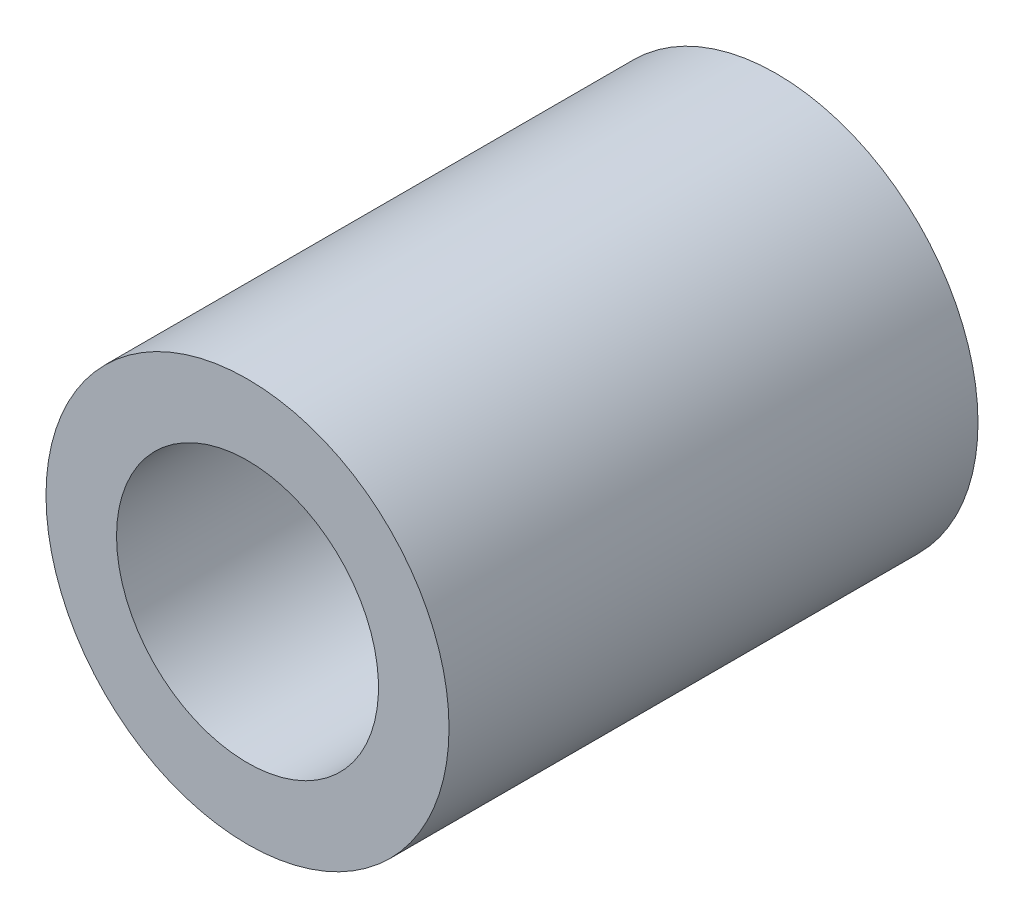
ISO-10303-21;
HEADER;
FILE_DESCRIPTION(('STEP AP214'),'2;1');
FILE_NAME('part.step','',(''),(''),'','','');
FILE_SCHEMA(('AUTOMOTIVE_DESIGN { 1 0 10303 214 1 1 1 1 }'));
ENDSEC;
DATA;
#1=APPLICATION_CONTEXT('core data for automotive mechanical design processes');
#2=APPLICATION_PROTOCOL_DEFINITION('international standard','automotive_design',2000,#1);
#3=PRODUCT_CONTEXT('',#1,'mechanical');
#4=PRODUCT('Part','Part','',(#3));
#5=PRODUCT_RELATED_PRODUCT_CATEGORY('part','',(#4));
#6=PRODUCT_DEFINITION_FORMATION('','',#4);
#7=PRODUCT_DEFINITION_CONTEXT('part definition',#1,'design');
#8=PRODUCT_DEFINITION('design','',#6,#7);
#9=PRODUCT_DEFINITION_SHAPE('','',#8);
#10=(LENGTH_UNIT() NAMED_UNIT(*) SI_UNIT(.MILLI.,.METRE.));
#11=(NAMED_UNIT(*) PLANE_ANGLE_UNIT() SI_UNIT($,.RADIAN.));
#12=(NAMED_UNIT(*) SI_UNIT($,.STERADIAN.) SOLID_ANGLE_UNIT());
#13=UNCERTAINTY_MEASURE_WITH_UNIT(LENGTH_MEASURE(1.E-05),#10,'distance_accuracy_value','');
#14=(GEOMETRIC_REPRESENTATION_CONTEXT(3) GLOBAL_UNCERTAINTY_ASSIGNED_CONTEXT((#13)) GLOBAL_UNIT_ASSIGNED_CONTEXT((#10,
#11,#12)) REPRESENTATION_CONTEXT('',''));
#15=CARTESIAN_POINT('',(0.,0.,0.));
#16=DIRECTION('',(0.,0.,1.));
#17=DIRECTION('',(1.,0.,0.));
#18=AXIS2_PLACEMENT_3D('',#15,#16,#17);
#19=CARTESIAN_POINT('',(0.,0.,10.5));
#20=DIRECTION('',(0.,0.,1.));
#21=DIRECTION('',(1.,0.,0.));
#22=AXIS2_PLACEMENT_3D('',#19,#20,#21);
#23=PLANE('',#22);
#24=CARTESIAN_POINT('',(0.,0.,10.5));
#25=DIRECTION('',(0.,0.,1.));
#26=DIRECTION('',(1.,0.,0.));
#27=AXIS2_PLACEMENT_3D('',#24,#25,#26);
#28=CIRCLE('',#27,4.);
#29=CARTESIAN_POINT('',(-4.,0.,10.5));
#30=VERTEX_POINT('',#29);
#31=EDGE_CURVE('E10',#30,#30,#28,.T.);
#32=ORIENTED_EDGE('',*,*,#31,.T.);
#33=EDGE_LOOP('',(#32));
#34=FACE_BOUND('',#33,.T.);
#35=CARTESIAN_POINT('',(0.,0.,10.5));
#36=DIRECTION('',(0.,0.,1.));
#37=DIRECTION('',(1.,0.,0.));
#38=AXIS2_PLACEMENT_3D('',#35,#36,#37);
#39=CIRCLE('',#38,2.6);
#40=CARTESIAN_POINT('',(-2.6,0.,10.5));
#41=VERTEX_POINT('',#40);
#42=EDGE_CURVE('E42',#41,#41,#39,.T.);
#43=ORIENTED_EDGE('',*,*,#42,.F.);
#44=EDGE_LOOP('',(#43));
#45=FACE_BOUND('',#44,.T.);
#46=ADVANCED_FACE('F31',(#34,#45),#23,.T.);
#47=CARTESIAN_POINT('',(0.,0.,0.));
#48=DIRECTION('',(0.,0.,1.));
#49=DIRECTION('',(1.,0.,0.));
#50=AXIS2_PLACEMENT_3D('',#47,#48,#49);
#51=PLANE('',#50);
#52=CARTESIAN_POINT('',(0.,0.,0.));
#53=DIRECTION('',(0.,0.,1.));
#54=DIRECTION('',(1.,0.,0.));
#55=AXIS2_PLACEMENT_3D('',#52,#53,#54);
#56=CIRCLE('',#55,4.);
#57=CARTESIAN_POINT('',(-4.,0.,0.));
#58=VERTEX_POINT('',#57);
#59=EDGE_CURVE('E35',#58,#58,#56,.T.);
#60=ORIENTED_EDGE('',*,*,#59,.F.);
#61=EDGE_LOOP('',(#60));
#62=FACE_BOUND('',#61,.T.);
#63=CARTESIAN_POINT('',(0.,0.,0.));
#64=DIRECTION('',(0.,0.,1.));
#65=DIRECTION('',(1.,0.,0.));
#66=AXIS2_PLACEMENT_3D('',#63,#64,#65);
#67=CIRCLE('',#66,2.6);
#68=CARTESIAN_POINT('',(-2.6,0.,0.));
#69=VERTEX_POINT('',#68);
#70=EDGE_CURVE('E44',#69,#69,#67,.T.);
#71=ORIENTED_EDGE('',*,*,#70,.T.);
#72=EDGE_LOOP('',(#71));
#73=FACE_BOUND('',#72,.T.);
#74=ADVANCED_FACE('F54',(#62,#73),#51,.F.);
#75=CARTESIAN_POINT('',(0.,0.,10.5));
#76=DIRECTION('',(0.,0.,-1.));
#77=DIRECTION('',(-1.,0.,0.));
#78=AXIS2_PLACEMENT_3D('',#75,#76,#77);
#79=CYLINDRICAL_SURFACE('',#78,4.);
#80=CARTESIAN_POINT('',(-4.,0.,10.5));
#81=CARTESIAN_POINT('',(-4.,0.,10.390625));
#82=CARTESIAN_POINT('',(-4.,0.,10.28125));
#83=CARTESIAN_POINT('',(-4.,0.,10.0625));
#84=CARTESIAN_POINT('',(-4.,0.,9.953125));
#85=CARTESIAN_POINT('',(-4.,0.,9.734375));
#86=CARTESIAN_POINT('',(-4.,0.,9.625));
#87=CARTESIAN_POINT('',(-4.,0.,9.40625));
#88=CARTESIAN_POINT('',(-4.,0.,9.296875));
#89=CARTESIAN_POINT('',(-4.,0.,9.078125));
#90=CARTESIAN_POINT('',(-4.,0.,8.96875));
#91=CARTESIAN_POINT('',(-4.,0.,8.75));
#92=CARTESIAN_POINT('',(-4.,0.,8.640625));
#93=CARTESIAN_POINT('',(-4.,0.,8.421875));
#94=CARTESIAN_POINT('',(-4.,0.,8.3125));
#95=CARTESIAN_POINT('',(-4.,0.,8.09375));
#96=CARTESIAN_POINT('',(-4.,0.,7.984375));
#97=CARTESIAN_POINT('',(-4.,0.,7.765625));
#98=CARTESIAN_POINT('',(-4.,0.,7.65625));
#99=CARTESIAN_POINT('',(-4.,0.,7.4375));
#100=CARTESIAN_POINT('',(-4.,0.,7.328125));
#101=CARTESIAN_POINT('',(-4.,0.,7.109375));
#102=CARTESIAN_POINT('',(-4.,0.,7.));
#103=CARTESIAN_POINT('',(-4.,0.,6.78125));
#104=CARTESIAN_POINT('',(-4.,0.,6.671875));
#105=CARTESIAN_POINT('',(-4.,0.,6.453125));
#106=CARTESIAN_POINT('',(-4.,0.,6.34375));
#107=CARTESIAN_POINT('',(-4.,0.,6.125));
#108=CARTESIAN_POINT('',(-4.,0.,6.015625));
#109=CARTESIAN_POINT('',(-4.,0.,5.796875));
#110=CARTESIAN_POINT('',(-4.,0.,5.6875));
#111=CARTESIAN_POINT('',(-4.,0.,5.46875));
#112=CARTESIAN_POINT('',(-4.,0.,5.359375));
#113=CARTESIAN_POINT('',(-4.,0.,5.140625));
#114=CARTESIAN_POINT('',(-4.,0.,5.03125));
#115=CARTESIAN_POINT('',(-4.,0.,4.8125));
#116=CARTESIAN_POINT('',(-4.,0.,4.703125));
#117=CARTESIAN_POINT('',(-4.,0.,4.484375));
#118=CARTESIAN_POINT('',(-4.,0.,4.375));
#119=CARTESIAN_POINT('',(-4.,0.,4.15625));
#120=CARTESIAN_POINT('',(-4.,0.,4.046875));
#121=CARTESIAN_POINT('',(-4.,0.,3.828125));
#122=CARTESIAN_POINT('',(-4.,0.,3.71875));
#123=CARTESIAN_POINT('',(-4.,0.,3.5));
#124=CARTESIAN_POINT('',(-4.,0.,3.390625));
#125=CARTESIAN_POINT('',(-4.,0.,3.171875));
#126=CARTESIAN_POINT('',(-4.,0.,3.0625));
#127=CARTESIAN_POINT('',(-4.,0.,2.84375));
#128=CARTESIAN_POINT('',(-4.,0.,2.734375));
#129=CARTESIAN_POINT('',(-4.,0.,2.515625));
#130=CARTESIAN_POINT('',(-4.,0.,2.40625));
#131=CARTESIAN_POINT('',(-4.,0.,2.1875));
#132=CARTESIAN_POINT('',(-4.,0.,2.078125));
#133=CARTESIAN_POINT('',(-4.,0.,1.859375));
#134=CARTESIAN_POINT('',(-4.,0.,1.75));
#135=CARTESIAN_POINT('',(-4.,0.,1.53125));
#136=CARTESIAN_POINT('',(-4.,0.,1.421875));
#137=CARTESIAN_POINT('',(-4.,0.,1.203125));
#138=CARTESIAN_POINT('',(-4.,0.,1.09375));
#139=CARTESIAN_POINT('',(-4.,0.,0.875000000000001));
#140=CARTESIAN_POINT('',(-4.,0.,0.765625000000001));
#141=CARTESIAN_POINT('',(-4.,0.,0.546875));
#142=CARTESIAN_POINT('',(-4.,0.,0.4375));
#143=CARTESIAN_POINT('',(-4.,0.,0.21875));
#144=CARTESIAN_POINT('',(-4.,0.,0.109375));
#145=CARTESIAN_POINT('',(-4.,0.,0.));
#146=B_SPLINE_CURVE_WITH_KNOTS('',3,(#80,#81,#82,#83,#84,#85,#86,#87,#88,#89,#90,#91,#92,#93,
#94,#95,#96,#97,#98,#99,#100,#101,#102,#103,#104,#105,#106,#107,#108,#109,#110,#111,#112,#113,
#114,#115,#116,#117,#118,#119,#120,#121,#122,#123,#124,#125,#126,#127,#128,#129,#130,#131,#132,
#133,#134,#135,#136,#137,#138,#139,#140,#141,#142,#143,#144,#145),.UNSPECIFIED.,.F.,.F.,(4,2,2,
2,2,2,2,2,2,2,2,2,2,2,2,2,2,2,2,2,2,2,2,2,2,2,2,2,2,2,2,2,4),(0.,0.328124999999999,
0.656249999999999,0.984374999999999,1.3125,1.640625,1.96875,2.296875,2.625,2.953125,3.28125,
3.609375,3.9375,4.265625,4.59375,4.921875,5.25,5.578125,5.90625,6.234375,6.5625,6.890625,
7.21875,7.546875,7.875,8.203125,8.53125,8.859375,9.1875,9.515625,9.84375,10.171875,10.5),.UNSPECIFIED.);
#147=EDGE_CURVE('BSEAM33',#30,#58,#146,.T.);
#148=ORIENTED_EDGE('',*,*,#31,.F.);
#149=ORIENTED_EDGE('',*,*,#59,.T.);
#150=ORIENTED_EDGE('',*,*,#147,.T.);
#151=ORIENTED_EDGE('',*,*,#147,.F.);
#152=EDGE_LOOP('',(#148,#150,#149,#151));
#153=FACE_BOUND('',#152,.T.);
#154=ADVANCED_FACE('F33',(#153),#79,.T.);
#155=CARTESIAN_POINT('',(0.,0.,10.5));
#156=DIRECTION('',(0.,0.,-1.));
#157=DIRECTION('',(-1.,0.,0.));
#158=AXIS2_PLACEMENT_3D('',#155,#156,#157);
#159=CYLINDRICAL_SURFACE('',#158,2.6);
#160=CARTESIAN_POINT('',(-2.6,0.,10.5));
#161=CARTESIAN_POINT('',(-2.6,0.,10.390625));
#162=CARTESIAN_POINT('',(-2.6,0.,10.28125));
#163=CARTESIAN_POINT('',(-2.6,0.,10.0625));
#164=CARTESIAN_POINT('',(-2.6,0.,9.953125));
#165=CARTESIAN_POINT('',(-2.6,0.,9.734375));
#166=CARTESIAN_POINT('',(-2.6,0.,9.625));
#167=CARTESIAN_POINT('',(-2.6,0.,9.40625));
#168=CARTESIAN_POINT('',(-2.6,0.,9.296875));
#169=CARTESIAN_POINT('',(-2.6,0.,9.078125));
#170=CARTESIAN_POINT('',(-2.6,0.,8.96875));
#171=CARTESIAN_POINT('',(-2.6,0.,8.75));
#172=CARTESIAN_POINT('',(-2.6,0.,8.640625));
#173=CARTESIAN_POINT('',(-2.6,0.,8.421875));
#174=CARTESIAN_POINT('',(-2.6,0.,8.3125));
#175=CARTESIAN_POINT('',(-2.6,0.,8.09375));
#176=CARTESIAN_POINT('',(-2.6,0.,7.984375));
#177=CARTESIAN_POINT('',(-2.6,0.,7.765625));
#178=CARTESIAN_POINT('',(-2.6,0.,7.65625));
#179=CARTESIAN_POINT('',(-2.6,0.,7.4375));
#180=CARTESIAN_POINT('',(-2.6,0.,7.328125));
#181=CARTESIAN_POINT('',(-2.6,0.,7.109375));
#182=CARTESIAN_POINT('',(-2.6,0.,7.));
#183=CARTESIAN_POINT('',(-2.6,0.,6.78125));
#184=CARTESIAN_POINT('',(-2.6,0.,6.671875));
#185=CARTESIAN_POINT('',(-2.6,0.,6.453125));
#186=CARTESIAN_POINT('',(-2.6,0.,6.34375));
#187=CARTESIAN_POINT('',(-2.6,0.,6.125));
#188=CARTESIAN_POINT('',(-2.6,0.,6.015625));
#189=CARTESIAN_POINT('',(-2.6,0.,5.796875));
#190=CARTESIAN_POINT('',(-2.6,0.,5.6875));
#191=CARTESIAN_POINT('',(-2.6,0.,5.46875));
#192=CARTESIAN_POINT('',(-2.6,0.,5.359375));
#193=CARTESIAN_POINT('',(-2.6,0.,5.140625));
#194=CARTESIAN_POINT('',(-2.6,0.,5.03125));
#195=CARTESIAN_POINT('',(-2.6,0.,4.8125));
#196=CARTESIAN_POINT('',(-2.6,0.,4.703125));
#197=CARTESIAN_POINT('',(-2.6,0.,4.484375));
#198=CARTESIAN_POINT('',(-2.6,0.,4.375));
#199=CARTESIAN_POINT('',(-2.6,0.,4.15625));
#200=CARTESIAN_POINT('',(-2.6,0.,4.046875));
#201=CARTESIAN_POINT('',(-2.6,0.,3.828125));
#202=CARTESIAN_POINT('',(-2.6,0.,3.71875));
#203=CARTESIAN_POINT('',(-2.6,0.,3.5));
#204=CARTESIAN_POINT('',(-2.6,0.,3.390625));
#205=CARTESIAN_POINT('',(-2.6,0.,3.171875));
#206=CARTESIAN_POINT('',(-2.6,0.,3.0625));
#207=CARTESIAN_POINT('',(-2.6,0.,2.84375));
#208=CARTESIAN_POINT('',(-2.6,0.,2.734375));
#209=CARTESIAN_POINT('',(-2.6,0.,2.515625));
#210=CARTESIAN_POINT('',(-2.6,0.,2.40625));
#211=CARTESIAN_POINT('',(-2.6,0.,2.1875));
#212=CARTESIAN_POINT('',(-2.6,0.,2.078125));
#213=CARTESIAN_POINT('',(-2.6,0.,1.859375));
#214=CARTESIAN_POINT('',(-2.6,0.,1.75));
#215=CARTESIAN_POINT('',(-2.6,0.,1.53125));
#216=CARTESIAN_POINT('',(-2.6,0.,1.421875));
#217=CARTESIAN_POINT('',(-2.6,0.,1.203125));
#218=CARTESIAN_POINT('',(-2.6,0.,1.09375));
#219=CARTESIAN_POINT('',(-2.6,0.,0.875000000000001));
#220=CARTESIAN_POINT('',(-2.6,0.,0.765625000000001));
#221=CARTESIAN_POINT('',(-2.6,0.,0.546875));
#222=CARTESIAN_POINT('',(-2.6,0.,0.4375));
#223=CARTESIAN_POINT('',(-2.6,0.,0.21875));
#224=CARTESIAN_POINT('',(-2.6,0.,0.109375));
#225=CARTESIAN_POINT('',(-2.6,0.,0.));
#226=B_SPLINE_CURVE_WITH_KNOTS('',3,(#160,#161,#162,#163,#164,#165,#166,#167,#168,#169,#170,
#171,#172,#173,#174,#175,#176,#177,#178,#179,#180,#181,#182,#183,#184,#185,#186,#187,#188,#189,
#190,#191,#192,#193,#194,#195,#196,#197,#198,#199,#200,#201,#202,#203,#204,#205,#206,#207,#208,
#209,#210,#211,#212,#213,#214,#215,#216,#217,#218,#219,#220,#221,#222,#223,#224,#225),
.UNSPECIFIED.,.F.,.F.,(4,2,2,2,2,2,2,2,2,2,2,2,2,2,2,2,2,2,2,2,2,2,2,2,2,2,2,2,2,2,2,2,4),(0.,
0.328125,0.656250000000001,0.984375000000001,1.3125,1.640625,1.96875,2.296875,2.625,2.953125,
3.28125,3.609375,3.9375,4.265625,4.59375,4.921875,5.25,5.578125,5.90625,6.234375,6.5625,
6.890625,7.21875,7.546875,7.875,8.203125,8.53125,8.859375,9.1875,9.515625,9.84375,10.171875,
10.5),.UNSPECIFIED.);
#227=EDGE_CURVE('BSEAM50',#41,#69,#226,.T.);
#228=ORIENTED_EDGE('',*,*,#42,.T.);
#229=ORIENTED_EDGE('',*,*,#70,.F.);
#230=ORIENTED_EDGE('',*,*,#227,.T.);
#231=ORIENTED_EDGE('',*,*,#227,.F.);
#232=EDGE_LOOP('',(#228,#230,#229,#231));
#233=FACE_BOUND('',#232,.T.);
#234=ADVANCED_FACE('F50',(#233),#159,.F.);
#235=CLOSED_SHELL('',(#46,#74,#154,#234));
#236=MANIFOLD_SOLID_BREP('B2',#235);
#237=ADVANCED_BREP_SHAPE_REPRESENTATION('',(#18,#236),#14);
#238=SHAPE_DEFINITION_REPRESENTATION(#9,#237);
ENDSEC;
END-ISO-10303-21;
